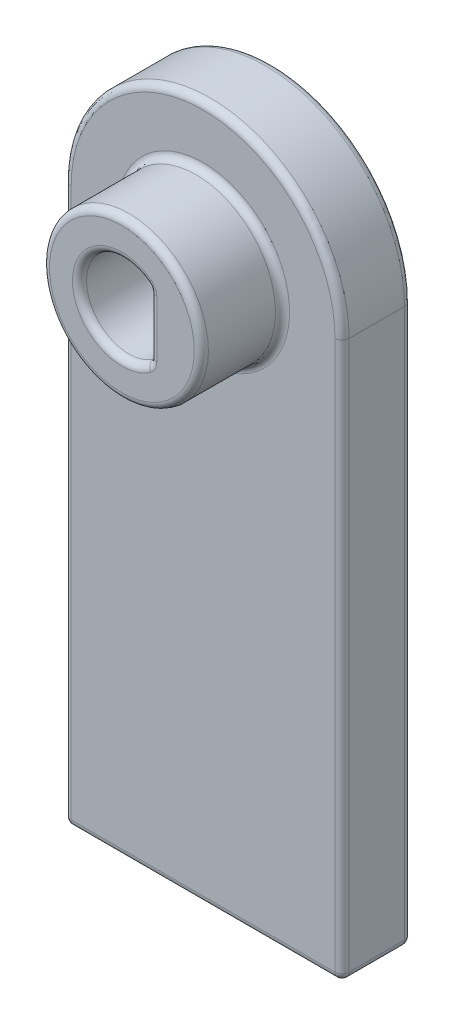
ISO-10303-21;
HEADER;
FILE_DESCRIPTION(('STEP AP214'),'2;1');
FILE_NAME('part.step','',(''),(''),'','','');
FILE_SCHEMA(('AUTOMOTIVE_DESIGN { 1 0 10303 214 1 1 1 1 }'));
ENDSEC;
DATA;
#1=APPLICATION_CONTEXT('core data for automotive mechanical design processes');
#2=APPLICATION_PROTOCOL_DEFINITION('international standard','automotive_design',2000,#1);
#3=PRODUCT_CONTEXT('',#1,'mechanical');
#4=PRODUCT('Part','Part','',(#3));
#5=PRODUCT_RELATED_PRODUCT_CATEGORY('part','',(#4));
#6=PRODUCT_DEFINITION_FORMATION('','',#4);
#7=PRODUCT_DEFINITION_CONTEXT('part definition',#1,'design');
#8=PRODUCT_DEFINITION('design','',#6,#7);
#9=PRODUCT_DEFINITION_SHAPE('','',#8);
#10=(LENGTH_UNIT() NAMED_UNIT(*) SI_UNIT(.MILLI.,.METRE.));
#11=(NAMED_UNIT(*) PLANE_ANGLE_UNIT() SI_UNIT($,.RADIAN.));
#12=(NAMED_UNIT(*) SI_UNIT($,.STERADIAN.) SOLID_ANGLE_UNIT());
#13=UNCERTAINTY_MEASURE_WITH_UNIT(LENGTH_MEASURE(1.E-05),#10,'distance_accuracy_value','');
#14=(GEOMETRIC_REPRESENTATION_CONTEXT(3) GLOBAL_UNCERTAINTY_ASSIGNED_CONTEXT((#13)) GLOBAL_UNIT_ASSIGNED_CONTEXT((#10,
#11,#12)) REPRESENTATION_CONTEXT('',''));
#15=CARTESIAN_POINT('',(0.,0.,0.));
#16=DIRECTION('',(0.,0.,1.));
#17=DIRECTION('',(1.,0.,0.));
#18=AXIS2_PLACEMENT_3D('',#15,#16,#17);
#19=CARTESIAN_POINT('',(0.,0.,5.));
#20=DIRECTION('',(0.,0.,-1.));
#21=DIRECTION('',(-1.,0.,0.));
#22=AXIS2_PLACEMENT_3D('',#19,#20,#21);
#23=PLANE('',#22);
#24=DIRECTION('',(0.,-1.,0.));
#25=VECTOR('',#24,1.);
#26=CARTESIAN_POINT('',(-9.492,0.,5.));
#27=LINE('',#26,#25);
#28=CARTESIAN_POINT('',(-9.492,0.,5.));
#29=VERTEX_POINT('',#28);
#30=CARTESIAN_POINT('',(-9.492,-39.492,5.));
#31=VERTEX_POINT('',#30);
#32=EDGE_CURVE('E270',#29,#31,#27,.T.);
#33=ORIENTED_EDGE('',*,*,#32,.T.);
#34=DIRECTION('',(1.,0.,0.));
#35=VECTOR('',#34,1.);
#36=CARTESIAN_POINT('',(0.,-39.492,5.));
#37=LINE('',#36,#35);
#38=CARTESIAN_POINT('',(9.492,-39.492,5.));
#39=VERTEX_POINT('',#38);
#40=EDGE_CURVE('E277',#31,#39,#37,.T.);
#41=ORIENTED_EDGE('',*,*,#40,.T.);
#42=DIRECTION('',(0.,1.,0.));
#43=VECTOR('',#42,1.);
#44=CARTESIAN_POINT('',(9.492,0.,5.));
#45=LINE('',#44,#43);
#46=CARTESIAN_POINT('',(9.492,0.,5.));
#47=VERTEX_POINT('',#46);
#48=EDGE_CURVE('E273',#39,#47,#45,.T.);
#49=ORIENTED_EDGE('',*,*,#48,.T.);
#50=CARTESIAN_POINT('',(0.,0.,5.));
#51=DIRECTION('',(0.,0.,-1.));
#52=DIRECTION('',(-1.,0.,0.));
#53=AXIS2_PLACEMENT_3D('',#50,#51,#52);
#54=CIRCLE('',#53,9.492);
#55=EDGE_CURVE('E267',#47,#29,#54,.F.);
#56=ORIENTED_EDGE('',*,*,#55,.T.);
#57=EDGE_LOOP('',(#33,#41,#49,#56));
#58=FACE_BOUND('',#57,.T.);
#59=CARTESIAN_POINT('',(0.,0.,5.));
#60=DIRECTION('',(0.,0.,-1.));
#61=DIRECTION('',(-1.,0.,0.));
#62=AXIS2_PLACEMENT_3D('',#59,#60,#61);
#63=CIRCLE('',#62,6.223);
#64=CARTESIAN_POINT('',(-6.223,0.,5.));
#65=VERTEX_POINT('',#64);
#66=EDGE_CURVE('E263',#65,#65,#63,.T.);
#67=ORIENTED_EDGE('',*,*,#66,.T.);
#68=EDGE_LOOP('',(#67));
#69=FACE_BOUND('',#68,.T.);
#70=ADVANCED_FACE('F39',(#58,#69),#23,.F.);
#71=CARTESIAN_POINT('',(0.,0.,5.));
#72=DIRECTION('',(0.,0.,-1.));
#73=DIRECTION('',(-1.,0.,0.));
#74=AXIS2_PLACEMENT_3D('',#71,#72,#73);
#75=CYLINDRICAL_SURFACE('',#74,10.);
#76=DIRECTION('',(0.,0.,-1.));
#77=VECTOR('',#76,1.);
#78=CARTESIAN_POINT('',(-10.,0.,5.));
#79=LINE('',#78,#77);
#80=CARTESIAN_POINT('',(-10.,0.,4.492));
#81=VERTEX_POINT('',#80);
#82=CARTESIAN_POINT('',(-10.,0.,0.508));
#83=VERTEX_POINT('',#82);
#84=EDGE_CURVE('E208',#81,#83,#79,.T.);
#85=ORIENTED_EDGE('',*,*,#84,.F.);
#86=CARTESIAN_POINT('',(0.,0.,4.492));
#87=DIRECTION('',(0.,0.,-1.));
#88=DIRECTION('',(-1.,0.,0.));
#89=AXIS2_PLACEMENT_3D('',#86,#87,#88);
#90=CIRCLE('',#89,10.);
#91=CARTESIAN_POINT('',(10.,0.,4.492));
#92=VERTEX_POINT('',#91);
#93=EDGE_CURVE('E325',#81,#92,#90,.T.);
#94=ORIENTED_EDGE('',*,*,#93,.T.);
#95=DIRECTION('',(0.,0.,-1.));
#96=VECTOR('',#95,1.);
#97=CARTESIAN_POINT('',(10.,0.,5.));
#98=LINE('',#97,#96);
#99=CARTESIAN_POINT('',(10.,0.,0.508));
#100=VERTEX_POINT('',#99);
#101=EDGE_CURVE('E212',#92,#100,#98,.T.);
#102=ORIENTED_EDGE('',*,*,#101,.T.);
#103=CARTESIAN_POINT('',(0.,0.,0.508));
#104=DIRECTION('',(0.,0.,-1.));
#105=DIRECTION('',(-1.,0.,0.));
#106=AXIS2_PLACEMENT_3D('',#103,#104,#105);
#107=CIRCLE('',#106,10.);
#108=EDGE_CURVE('E322',#100,#83,#107,.F.);
#109=ORIENTED_EDGE('',*,*,#108,.T.);
#110=EDGE_LOOP('',(#85,#94,#102,#109));
#111=FACE_BOUND('',#110,.T.);
#112=ADVANCED_FACE('F440',(#111),#75,.T.);
#113=CARTESIAN_POINT('',(-10.,0.,5.));
#114=DIRECTION('',(1.,0.,0.));
#115=DIRECTION('',(0.,1.,0.));
#116=AXIS2_PLACEMENT_3D('',#113,#114,#115);
#117=PLANE('',#116);
#118=DIRECTION('',(0.,0.,-1.));
#119=VECTOR('',#118,1.);
#120=CARTESIAN_POINT('',(-9.99999999999999,-39.492,5.));
#121=LINE('',#120,#119);
#122=CARTESIAN_POINT('',(-9.99999999999999,-39.492,0.508));
#123=VERTEX_POINT('',#122);
#124=CARTESIAN_POINT('',(-9.99999999999999,-39.492,4.492));
#125=VERTEX_POINT('',#124);
#126=EDGE_CURVE('E290',#123,#125,#121,.F.);
#127=ORIENTED_EDGE('',*,*,#126,.T.);
#128=DIRECTION('',(0.,-1.,0.));
#129=VECTOR('',#128,1.);
#130=CARTESIAN_POINT('',(-10.,0.,4.492));
#131=LINE('',#130,#129);
#132=EDGE_CURVE('E296',#125,#81,#131,.F.);
#133=ORIENTED_EDGE('',*,*,#132,.T.);
#134=ORIENTED_EDGE('',*,*,#84,.T.);
#135=DIRECTION('',(0.,-1.,0.));
#136=VECTOR('',#135,1.);
#137=CARTESIAN_POINT('',(-9.99999999999999,-40.,0.508));
#138=LINE('',#137,#136);
#139=EDGE_CURVE('E293',#83,#123,#138,.T.);
#140=ORIENTED_EDGE('',*,*,#139,.T.);
#141=EDGE_LOOP('',(#127,#133,#134,#140));
#142=FACE_BOUND('',#141,.T.);
#143=ADVANCED_FACE('F433',(#142),#117,.F.);
#144=CARTESIAN_POINT('',(-9.99999999999999,-40.,5.));
#145=DIRECTION('',(0.,1.,0.));
#146=DIRECTION('',(0.,0.,1.));
#147=AXIS2_PLACEMENT_3D('',#144,#145,#146);
#148=PLANE('',#147);
#149=DIRECTION('',(1.,0.,0.));
#150=VECTOR('',#149,1.);
#151=CARTESIAN_POINT('',(-9.99999999999999,-40.,4.492));
#152=LINE('',#151,#150);
#153=CARTESIAN_POINT('',(9.492,-40.,4.492));
#154=VERTEX_POINT('',#153);
#155=CARTESIAN_POINT('',(-9.492,-40.,4.492));
#156=VERTEX_POINT('',#155);
#157=EDGE_CURVE('E57',#154,#156,#152,.F.);
#158=ORIENTED_EDGE('',*,*,#157,.T.);
#159=DIRECTION('',(0.,0.,-1.));
#160=VECTOR('',#159,1.);
#161=CARTESIAN_POINT('',(-9.492,-40.,5.));
#162=LINE('',#161,#160);
#163=CARTESIAN_POINT('',(-9.492,-40.,0.508));
#164=VERTEX_POINT('',#163);
#165=EDGE_CURVE('E319',#156,#164,#162,.T.);
#166=ORIENTED_EDGE('',*,*,#165,.T.);
#167=DIRECTION('',(1.,0.,0.));
#168=VECTOR('',#167,1.);
#169=CARTESIAN_POINT('',(10.,-40.,0.508));
#170=LINE('',#169,#168);
#171=CARTESIAN_POINT('',(9.492,-40.,0.508));
#172=VERTEX_POINT('',#171);
#173=EDGE_CURVE('E312',#164,#172,#170,.T.);
#174=ORIENTED_EDGE('',*,*,#173,.T.);
#175=DIRECTION('',(0.,0.,-1.));
#176=VECTOR('',#175,1.);
#177=CARTESIAN_POINT('',(9.492,-40.,5.));
#178=LINE('',#177,#176);
#179=EDGE_CURVE('E62',#172,#154,#178,.F.);
#180=ORIENTED_EDGE('',*,*,#179,.T.);
#181=EDGE_LOOP('',(#158,#166,#174,#180));
#182=FACE_BOUND('',#181,.T.);
#183=ADVANCED_FACE('F485',(#182),#148,.F.);
#184=CARTESIAN_POINT('',(10.,-40.,5.));
#185=DIRECTION('',(-1.,0.,0.));
#186=DIRECTION('',(0.,-1.,0.));
#187=AXIS2_PLACEMENT_3D('',#184,#185,#186);
#188=PLANE('',#187);
#189=ORIENTED_EDGE('',*,*,#101,.F.);
#190=DIRECTION('',(0.,1.,0.));
#191=VECTOR('',#190,1.);
#192=CARTESIAN_POINT('',(10.,-40.,4.492));
#193=LINE('',#192,#191);
#194=CARTESIAN_POINT('',(10.,-39.492,4.492));
#195=VERTEX_POINT('',#194);
#196=EDGE_CURVE('E286',#92,#195,#193,.F.);
#197=ORIENTED_EDGE('',*,*,#196,.T.);
#198=DIRECTION('',(0.,0.,-1.));
#199=VECTOR('',#198,1.);
#200=CARTESIAN_POINT('',(10.,-39.492,5.));
#201=LINE('',#200,#199);
#202=CARTESIAN_POINT('',(10.,-39.492,0.508));
#203=VERTEX_POINT('',#202);
#204=EDGE_CURVE('E280',#195,#203,#201,.T.);
#205=ORIENTED_EDGE('',*,*,#204,.T.);
#206=DIRECTION('',(0.,1.,0.));
#207=VECTOR('',#206,1.);
#208=CARTESIAN_POINT('',(10.,0.,0.508));
#209=LINE('',#208,#207);
#210=EDGE_CURVE('E283',#203,#100,#209,.T.);
#211=ORIENTED_EDGE('',*,*,#210,.T.);
#212=EDGE_LOOP('',(#189,#197,#205,#211));
#213=FACE_BOUND('',#212,.T.);
#214=ADVANCED_FACE('F457',(#213),#188,.F.);
#215=CARTESIAN_POINT('',(0.,0.,0.));
#216=DIRECTION('',(0.,0.,-1.));
#217=DIRECTION('',(-1.,0.,0.));
#218=AXIS2_PLACEMENT_3D('',#215,#216,#217);
#219=PLANE('',#218);
#220=CARTESIAN_POINT('',(1.49512256240101,-2.0558143212361,0.));
#221=DIRECTION('',(0.,0.,-1.));
#222=DIRECTION('',(-1.,0.,0.));
#223=AXIS2_PLACEMENT_3D('',#220,#221,#222);
#224=CIRCLE('',#223,1.016);
#225=CARTESIAN_POINT('',(2.51112256240101,-2.0558143212361,0.));
#226=VERTEX_POINT('',#225);
#227=CARTESIAN_POINT('',(2.09270105311676,-2.87749305859875,0.));
#228=VERTEX_POINT('',#227);
#229=EDGE_CURVE('E252',#226,#228,#224,.T.);
#230=ORIENTED_EDGE('',*,*,#229,.F.);
#231=DIRECTION('',(0.,1.,0.));
#232=VECTOR('',#231,1.);
#233=CARTESIAN_POINT('',(2.51112256240101,0.,0.));
#234=LINE('',#233,#232);
#235=CARTESIAN_POINT('',(2.51112256240101,2.0558143212361,0.));
#236=VERTEX_POINT('',#235);
#237=EDGE_CURVE('E186',#226,#236,#234,.T.);
#238=ORIENTED_EDGE('',*,*,#237,.T.);
#239=CARTESIAN_POINT('',(1.49512256240101,2.0558143212361,0.));
#240=DIRECTION('',(0.,0.,-1.));
#241=DIRECTION('',(-1.,0.,0.));
#242=AXIS2_PLACEMENT_3D('',#239,#240,#241);
#243=CIRCLE('',#242,1.016);
#244=CARTESIAN_POINT('',(2.09270105311676,2.87749305859875,0.));
#245=VERTEX_POINT('',#244);
#246=EDGE_CURVE('E258',#245,#236,#243,.T.);
#247=ORIENTED_EDGE('',*,*,#246,.F.);
#248=CARTESIAN_POINT('',(0.,0.,0.));
#249=DIRECTION('',(0.,0.,-1.));
#250=DIRECTION('',(-1.,0.,0.));
#251=AXIS2_PLACEMENT_3D('',#248,#249,#250);
#252=CIRCLE('',#251,3.558);
#253=EDGE_CURVE('E255',#245,#228,#252,.F.);
#254=ORIENTED_EDGE('',*,*,#253,.T.);
#255=EDGE_LOOP('',(#230,#238,#247,#254));
#256=FACE_BOUND('',#255,.T.);
#257=DIRECTION('',(0.,1.,0.));
#258=VECTOR('',#257,1.);
#259=CARTESIAN_POINT('',(9.492,-40.,0.));
#260=LINE('',#259,#258);
#261=CARTESIAN_POINT('',(9.492,0.,0.));
#262=VERTEX_POINT('',#261);
#263=CARTESIAN_POINT('',(9.492,-39.492,0.));
#264=VERTEX_POINT('',#263);
#265=EDGE_CURVE('E245',#262,#264,#260,.F.);
#266=ORIENTED_EDGE('',*,*,#265,.T.);
#267=DIRECTION('',(1.,0.,0.));
#268=VECTOR('',#267,1.);
#269=CARTESIAN_POINT('',(-9.99999999999999,-39.492,0.));
#270=LINE('',#269,#268);
#271=CARTESIAN_POINT('',(-9.492,-39.492,0.));
#272=VERTEX_POINT('',#271);
#273=EDGE_CURVE('E249',#264,#272,#270,.F.);
#274=ORIENTED_EDGE('',*,*,#273,.T.);
#275=DIRECTION('',(0.,-1.,0.));
#276=VECTOR('',#275,1.);
#277=CARTESIAN_POINT('',(-9.492,0.,0.));
#278=LINE('',#277,#276);
#279=CARTESIAN_POINT('',(-9.492,0.,0.));
#280=VERTEX_POINT('',#279);
#281=EDGE_CURVE('E242',#272,#280,#278,.F.);
#282=ORIENTED_EDGE('',*,*,#281,.T.);
#283=CARTESIAN_POINT('',(0.,0.,0.));
#284=DIRECTION('',(0.,0.,-1.));
#285=DIRECTION('',(-1.,0.,0.));
#286=AXIS2_PLACEMENT_3D('',#283,#284,#285);
#287=CIRCLE('',#286,9.492);
#288=EDGE_CURVE('E239',#280,#262,#287,.T.);
#289=ORIENTED_EDGE('',*,*,#288,.T.);
#290=EDGE_LOOP('',(#266,#274,#282,#289));
#291=FACE_BOUND('',#290,.T.);
#292=ADVANCED_FACE('F489',(#256,#291),#219,.T.);
#293=CARTESIAN_POINT('',(0.,0.,10.842));
#294=DIRECTION('',(0.,0.,1.));
#295=DIRECTION('',(1.,0.,0.));
#296=AXIS2_PLACEMENT_3D('',#293,#294,#295);
#297=PLANE('',#296);
#298=CARTESIAN_POINT('',(1.49512256240101,2.0558143212361,10.842));
#299=DIRECTION('',(0.,0.,1.));
#300=DIRECTION('',(1.,0.,0.));
#301=AXIS2_PLACEMENT_3D('',#298,#299,#300);
#302=CIRCLE('',#301,1.016);
#303=CARTESIAN_POINT('',(2.51112256240101,2.0558143212361,10.842));
#304=VERTEX_POINT('',#303);
#305=CARTESIAN_POINT('',(2.09270105311676,2.87749305859875,10.842));
#306=VERTEX_POINT('',#305);
#307=EDGE_CURVE('E224',#304,#306,#302,.T.);
#308=ORIENTED_EDGE('',*,*,#307,.F.);
#309=DIRECTION('',(0.,1.,0.));
#310=VECTOR('',#309,1.);
#311=CARTESIAN_POINT('',(2.51112256240101,0.,10.842));
#312=LINE('',#311,#310);
#313=CARTESIAN_POINT('',(2.51112256240101,-2.0558143212361,10.842));
#314=VERTEX_POINT('',#313);
#315=EDGE_CURVE('E235',#304,#314,#312,.F.);
#316=ORIENTED_EDGE('',*,*,#315,.T.);
#317=CARTESIAN_POINT('',(1.49512256240101,-2.0558143212361,10.842));
#318=DIRECTION('',(0.,0.,1.));
#319=DIRECTION('',(1.,0.,0.));
#320=AXIS2_PLACEMENT_3D('',#317,#318,#319);
#321=CIRCLE('',#320,1.016);
#322=CARTESIAN_POINT('',(2.09270105311676,-2.87749305859875,10.842));
#323=VERTEX_POINT('',#322);
#324=EDGE_CURVE('E231',#323,#314,#321,.T.);
#325=ORIENTED_EDGE('',*,*,#324,.F.);
#326=CARTESIAN_POINT('',(0.,0.,10.842));
#327=DIRECTION('',(0.,0.,1.));
#328=DIRECTION('',(1.,0.,0.));
#329=AXIS2_PLACEMENT_3D('',#326,#327,#328);
#330=CIRCLE('',#329,3.558);
#331=EDGE_CURVE('E228',#323,#306,#330,.F.);
#332=ORIENTED_EDGE('',*,*,#331,.T.);
#333=EDGE_LOOP('',(#308,#316,#325,#332));
#334=FACE_BOUND('',#333,.T.);
#335=CARTESIAN_POINT('',(0.,0.,10.842));
#336=DIRECTION('',(0.,0.,1.));
#337=DIRECTION('',(1.,0.,0.));
#338=AXIS2_PLACEMENT_3D('',#335,#336,#337);
#339=CIRCLE('',#338,5.207);
#340=CARTESIAN_POINT('',(5.207,0.,10.842));
#341=VERTEX_POINT('',#340);
#342=EDGE_CURVE('E220',#341,#341,#339,.T.);
#343=ORIENTED_EDGE('',*,*,#342,.T.);
#344=EDGE_LOOP('',(#343));
#345=FACE_BOUND('',#344,.T.);
#346=ADVANCED_FACE('F491',(#334,#345),#297,.T.);
#347=CARTESIAN_POINT('',(0.,0.,10.842));
#348=DIRECTION('',(0.,0.,-1.));
#349=DIRECTION('',(-1.,0.,0.));
#350=AXIS2_PLACEMENT_3D('',#347,#348,#349);
#351=CYLINDRICAL_SURFACE('',#350,5.715);
#352=CARTESIAN_POINT('',(0.,0.,10.334));
#353=DIRECTION('',(0.,0.,1.));
#354=DIRECTION('',(1.,0.,0.));
#355=AXIS2_PLACEMENT_3D('',#352,#353,#354);
#356=CIRCLE('',#355,5.715);
#357=CARTESIAN_POINT('',(5.715,0.,10.334));
#358=VERTEX_POINT('',#357);
#359=EDGE_CURVE('E11',#358,#358,#356,.F.);
#360=ORIENTED_EDGE('',*,*,#359,.T.);
#361=EDGE_LOOP('',(#360));
#362=FACE_BOUND('',#361,.T.);
#363=CARTESIAN_POINT('',(0.,0.,5.508));
#364=DIRECTION('',(0.,0.,-1.));
#365=DIRECTION('',(-1.,0.,0.));
#366=AXIS2_PLACEMENT_3D('',#363,#364,#365);
#367=CIRCLE('',#366,5.715);
#368=CARTESIAN_POINT('',(-5.715,0.,5.508));
#369=VERTEX_POINT('',#368);
#370=EDGE_CURVE('E49',#369,#369,#367,.F.);
#371=ORIENTED_EDGE('',*,*,#370,.T.);
#372=EDGE_LOOP('',(#371));
#373=FACE_BOUND('',#372,.T.);
#374=ADVANCED_FACE('F498',(#362,#373),#351,.T.);
#375=CARTESIAN_POINT('',(0.,0.,10.842));
#376=DIRECTION('',(0.,0.,-1.));
#377=DIRECTION('',(-1.,0.,0.));
#378=AXIS2_PLACEMENT_3D('',#375,#376,#377);
#379=CYLINDRICAL_SURFACE('',#378,3.05);
#380=DIRECTION('',(0.,0.,-1.));
#381=VECTOR('',#380,1.);
#382=CARTESIAN_POINT('',(1.79391180775889,2.46665368991742,10.842));
#383=LINE('',#382,#381);
#384=CARTESIAN_POINT('',(1.79391180775889,2.46665368991742,0.508));
#385=VERTEX_POINT('',#384);
#386=CARTESIAN_POINT('',(1.79391180775889,2.46665368991742,10.334));
#387=VERTEX_POINT('',#386);
#388=EDGE_CURVE('E305',#385,#387,#383,.F.);
#389=ORIENTED_EDGE('',*,*,#388,.T.);
#390=CARTESIAN_POINT('',(0.,0.,10.334));
#391=DIRECTION('',(0.,0.,1.));
#392=DIRECTION('',(1.,0.,0.));
#393=AXIS2_PLACEMENT_3D('',#390,#391,#392);
#394=CIRCLE('',#393,3.05);
#395=CARTESIAN_POINT('',(1.79391180775889,-2.46665368991742,10.334));
#396=VERTEX_POINT('',#395);
#397=EDGE_CURVE('E308',#387,#396,#394,.T.);
#398=ORIENTED_EDGE('',*,*,#397,.T.);
#399=DIRECTION('',(0.,0.,-1.));
#400=VECTOR('',#399,1.);
#401=CARTESIAN_POINT('',(1.79391180775889,-2.46665368991742,10.842));
#402=LINE('',#401,#400);
#403=CARTESIAN_POINT('',(1.79391180775889,-2.46665368991742,0.508));
#404=VERTEX_POINT('',#403);
#405=EDGE_CURVE('E299',#396,#404,#402,.T.);
#406=ORIENTED_EDGE('',*,*,#405,.T.);
#407=CARTESIAN_POINT('',(0.,0.,0.508));
#408=DIRECTION('',(0.,0.,-1.));
#409=DIRECTION('',(-1.,0.,0.));
#410=AXIS2_PLACEMENT_3D('',#407,#408,#409);
#411=CIRCLE('',#410,3.05);
#412=EDGE_CURVE('E302',#404,#385,#411,.T.);
#413=ORIENTED_EDGE('',*,*,#412,.T.);
#414=EDGE_LOOP('',(#389,#398,#406,#413));
#415=FACE_BOUND('',#414,.T.);
#416=ADVANCED_FACE('F512',(#415),#379,.F.);
#417=CARTESIAN_POINT('',(2.00312256240101,2.3,10.842));
#418=DIRECTION('',(-1.,0.,0.));
#419=DIRECTION('',(0.,-1.,0.));
#420=AXIS2_PLACEMENT_3D('',#417,#418,#419);
#421=PLANE('',#420);
#422=DIRECTION('',(0.,1.,0.));
#423=VECTOR('',#422,1.);
#424=CARTESIAN_POINT('',(2.00312256240101,2.3,10.334));
#425=LINE('',#424,#423);
#426=CARTESIAN_POINT('',(2.00312256240101,-2.0558143212361,10.334));
#427=VERTEX_POINT('',#426);
#428=CARTESIAN_POINT('',(2.00312256240101,2.0558143212361,10.334));
#429=VERTEX_POINT('',#428);
#430=EDGE_CURVE('E178',#427,#429,#425,.T.);
#431=ORIENTED_EDGE('',*,*,#430,.T.);
#432=DIRECTION('',(0.,0.,1.));
#433=VECTOR('',#432,1.);
#434=CARTESIAN_POINT('',(2.00312256240101,2.0558143212361,0.));
#435=LINE('',#434,#433);
#436=CARTESIAN_POINT('',(2.00312256240101,2.0558143212361,0.508));
#437=VERTEX_POINT('',#436);
#438=EDGE_CURVE('E173',#429,#437,#435,.F.);
#439=ORIENTED_EDGE('',*,*,#438,.T.);
#440=DIRECTION('',(0.,1.,0.));
#441=VECTOR('',#440,1.);
#442=CARTESIAN_POINT('',(2.00312256240101,2.3,0.508));
#443=LINE('',#442,#441);
#444=CARTESIAN_POINT('',(2.00312256240101,-2.0558143212361,0.508));
#445=VERTEX_POINT('',#444);
#446=EDGE_CURVE('E165',#437,#445,#443,.F.);
#447=ORIENTED_EDGE('',*,*,#446,.T.);
#448=DIRECTION('',(0.,0.,1.));
#449=VECTOR('',#448,1.);
#450=CARTESIAN_POINT('',(2.00312256240101,-2.0558143212361,10.842));
#451=LINE('',#450,#449);
#452=EDGE_CURVE('E170',#445,#427,#451,.T.);
#453=ORIENTED_EDGE('',*,*,#452,.T.);
#454=EDGE_LOOP('',(#431,#439,#447,#453));
#455=FACE_BOUND('',#454,.T.);
#456=ADVANCED_FACE('F168',(#455),#421,.T.);
#457=CARTESIAN_POINT('',(2.51112256240101,0.,0.508));
#458=DIRECTION('',(0.,1.,0.));
#459=DIRECTION('',(-1.,0.,0.));
#460=AXIS2_PLACEMENT_3D('',#457,#458,#459);
#461=CYLINDRICAL_SURFACE('',#460,0.508);
#462=CARTESIAN_POINT('',(2.51112256240101,2.0558143212361,0.508));
#463=DIRECTION('',(0.,1.,0.));
#464=DIRECTION('',(0.,0.,1.));
#465=AXIS2_PLACEMENT_3D('',#462,#463,#464);
#466=CIRCLE('',#465,0.508);
#467=EDGE_CURVE('E191',#236,#437,#466,.T.);
#468=ORIENTED_EDGE('',*,*,#467,.F.);
#469=ORIENTED_EDGE('',*,*,#237,.F.);
#470=CARTESIAN_POINT('',(2.51112256240101,-2.0558143212361,0.508));
#471=DIRECTION('',(0.,-1.,0.));
#472=DIRECTION('',(0.,0.,-1.));
#473=AXIS2_PLACEMENT_3D('',#470,#471,#472);
#474=CIRCLE('',#473,0.508);
#475=EDGE_CURVE('E182',#445,#226,#474,.T.);
#476=ORIENTED_EDGE('',*,*,#475,.F.);
#477=ORIENTED_EDGE('',*,*,#446,.F.);
#478=EDGE_LOOP('',(#468,#469,#476,#477));
#479=FACE_BOUND('',#478,.T.);
#480=ADVANCED_FACE('F184',(#479),#461,.T.);
#481=CARTESIAN_POINT('',(0.,0.,0.508));
#482=DIRECTION('',(0.,0.,-1.));
#483=DIRECTION('',(-1.,0.,0.));
#484=AXIS2_PLACEMENT_3D('',#481,#482,#483);
#485=TOROIDAL_SURFACE('',#484,3.558,0.508);
#486=CARTESIAN_POINT('',(2.09270105311676,-2.87749305859875,0.508));
#487=DIRECTION('',(0.808738914727024,0.588167805822586,0.));
#488=DIRECTION('',(-0.588167805822586,0.808738914727024,0.));
#489=AXIS2_PLACEMENT_3D('',#486,#487,#488);
#490=CIRCLE('',#489,0.508);
#491=EDGE_CURVE('E190',#228,#404,#490,.T.);
#492=ORIENTED_EDGE('',*,*,#491,.F.);
#493=ORIENTED_EDGE('',*,*,#253,.F.);
#494=CARTESIAN_POINT('',(2.09270105311676,2.87749305859875,0.508));
#495=DIRECTION('',(0.808738914727025,-0.588167805822586,0.));
#496=DIRECTION('',(0.588167805822586,0.808738914727025,0.));
#497=AXIS2_PLACEMENT_3D('',#494,#495,#496);
#498=CIRCLE('',#497,0.508);
#499=EDGE_CURVE('E201',#385,#245,#498,.T.);
#500=ORIENTED_EDGE('',*,*,#499,.F.);
#501=ORIENTED_EDGE('',*,*,#412,.F.);
#502=EDGE_LOOP('',(#492,#493,#500,#501));
#503=FACE_BOUND('',#502,.T.);
#504=ADVANCED_FACE('F522',(#503),#485,.T.);
#505=CARTESIAN_POINT('',(1.49512256240101,-2.0558143212361,0.508));
#506=DIRECTION('',(0.,0.,-1.));
#507=DIRECTION('',(-1.,0.,0.));
#508=AXIS2_PLACEMENT_3D('',#505,#506,#507);
#509=TOROIDAL_SURFACE('',#508,1.016,0.508);
#510=ORIENTED_EDGE('',*,*,#229,.T.);
#511=ORIENTED_EDGE('',*,*,#491,.T.);
#512=CARTESIAN_POINT('',(1.49512256240101,-2.0558143212361,0.508));
#513=DIRECTION('',(0.,0.,-1.));
#514=DIRECTION('',(-1.,0.,0.));
#515=AXIS2_PLACEMENT_3D('',#512,#513,#514);
#516=CIRCLE('',#515,0.508);
#517=EDGE_CURVE('E195',#445,#404,#516,.T.);
#518=ORIENTED_EDGE('',*,*,#517,.F.);
#519=ORIENTED_EDGE('',*,*,#475,.T.);
#520=EDGE_LOOP('',(#510,#511,#518,#519));
#521=FACE_BOUND('',#520,.T.);
#522=ADVANCED_FACE('F196',(#521),#509,.T.);
#523=CARTESIAN_POINT('',(1.49512256240101,2.0558143212361,0.508));
#524=DIRECTION('',(0.,0.,-1.));
#525=DIRECTION('',(-1.,0.,0.));
#526=AXIS2_PLACEMENT_3D('',#523,#524,#525);
#527=TOROIDAL_SURFACE('',#526,1.016,0.508);
#528=ORIENTED_EDGE('',*,*,#246,.T.);
#529=ORIENTED_EDGE('',*,*,#467,.T.);
#530=CARTESIAN_POINT('',(1.49512256240101,2.0558143212361,0.508));
#531=DIRECTION('',(0.,0.,-1.));
#532=DIRECTION('',(-1.,0.,0.));
#533=AXIS2_PLACEMENT_3D('',#530,#531,#532);
#534=CIRCLE('',#533,0.508);
#535=EDGE_CURVE('E202',#385,#437,#534,.T.);
#536=ORIENTED_EDGE('',*,*,#535,.F.);
#537=ORIENTED_EDGE('',*,*,#499,.T.);
#538=EDGE_LOOP('',(#528,#529,#536,#537));
#539=FACE_BOUND('',#538,.T.);
#540=ADVANCED_FACE('F723',(#539),#527,.T.);
#541=CARTESIAN_POINT('',(1.49512256240101,-2.0558143212361,10.842));
#542=DIRECTION('',(0.,0.,-1.));
#543=DIRECTION('',(-1.,0.,0.));
#544=AXIS2_PLACEMENT_3D('',#541,#542,#543);
#545=CYLINDRICAL_SURFACE('',#544,0.508);
#546=ORIENTED_EDGE('',*,*,#517,.T.);
#547=ORIENTED_EDGE('',*,*,#405,.F.);
#548=CARTESIAN_POINT('',(1.49512256240101,-2.0558143212361,10.334));
#549=DIRECTION('',(0.,0.,1.));
#550=DIRECTION('',(1.,0.,0.));
#551=AXIS2_PLACEMENT_3D('',#548,#549,#550);
#552=CIRCLE('',#551,0.508);
#553=EDGE_CURVE('E205',#427,#396,#552,.F.);
#554=ORIENTED_EDGE('',*,*,#553,.F.);
#555=ORIENTED_EDGE('',*,*,#452,.F.);
#556=EDGE_LOOP('',(#546,#547,#554,#555));
#557=FACE_BOUND('',#556,.T.);
#558=ADVANCED_FACE('F204',(#557),#545,.F.);
#559=CARTESIAN_POINT('',(1.49512256240101,2.0558143212361,10.842));
#560=DIRECTION('',(0.,0.,-1.));
#561=DIRECTION('',(-1.,0.,0.));
#562=AXIS2_PLACEMENT_3D('',#559,#560,#561);
#563=CYLINDRICAL_SURFACE('',#562,0.508);
#564=ORIENTED_EDGE('',*,*,#535,.T.);
#565=ORIENTED_EDGE('',*,*,#438,.F.);
#566=CARTESIAN_POINT('',(1.49512256240101,2.0558143212361,10.334));
#567=DIRECTION('',(0.,0.,1.));
#568=DIRECTION('',(1.,0.,0.));
#569=AXIS2_PLACEMENT_3D('',#566,#567,#568);
#570=CIRCLE('',#569,0.508);
#571=EDGE_CURVE('E341',#387,#429,#570,.F.);
#572=ORIENTED_EDGE('',*,*,#571,.F.);
#573=ORIENTED_EDGE('',*,*,#388,.F.);
#574=EDGE_LOOP('',(#564,#565,#572,#573));
#575=FACE_BOUND('',#574,.T.);
#576=ADVANCED_FACE('F704',(#575),#563,.F.);
#577=CARTESIAN_POINT('',(0.,0.,10.334));
#578=DIRECTION('',(0.,0.,1.));
#579=DIRECTION('',(1.,0.,0.));
#580=AXIS2_PLACEMENT_3D('',#577,#578,#579);
#581=TOROIDAL_SURFACE('',#580,3.558,0.508);
#582=CARTESIAN_POINT('',(2.09270105311676,2.87749305859875,10.334));
#583=DIRECTION('',(0.808738914727024,-0.588167805822585,0.));
#584=DIRECTION('',(0.588167805822585,0.808738914727025,0.));
#585=AXIS2_PLACEMENT_3D('',#582,#583,#584);
#586=CIRCLE('',#585,0.508);
#587=EDGE_CURVE('E337',#306,#387,#586,.T.);
#588=ORIENTED_EDGE('',*,*,#587,.F.);
#589=ORIENTED_EDGE('',*,*,#331,.F.);
#590=CARTESIAN_POINT('',(2.09270105311676,-2.87749305859875,10.334));
#591=DIRECTION('',(0.808738914727024,0.588167805822586,0.));
#592=DIRECTION('',(-0.588167805822586,0.808738914727024,0.));
#593=AXIS2_PLACEMENT_3D('',#590,#591,#592);
#594=CIRCLE('',#593,0.508);
#595=EDGE_CURVE('E347',#396,#323,#594,.T.);
#596=ORIENTED_EDGE('',*,*,#595,.F.);
#597=ORIENTED_EDGE('',*,*,#397,.F.);
#598=EDGE_LOOP('',(#588,#589,#596,#597));
#599=FACE_BOUND('',#598,.T.);
#600=ADVANCED_FACE('F694',(#599),#581,.T.);
#601=CARTESIAN_POINT('',(1.49512256240101,-2.0558143212361,10.334));
#602=DIRECTION('',(0.,0.,1.));
#603=DIRECTION('',(1.,0.,0.));
#604=AXIS2_PLACEMENT_3D('',#601,#602,#603);
#605=TOROIDAL_SURFACE('',#604,1.016,0.508);
#606=ORIENTED_EDGE('',*,*,#595,.T.);
#607=ORIENTED_EDGE('',*,*,#324,.T.);
#608=CARTESIAN_POINT('',(2.51112256240101,-2.0558143212361,10.334));
#609=DIRECTION('',(0.,-1.,0.));
#610=DIRECTION('',(0.,0.,-1.));
#611=AXIS2_PLACEMENT_3D('',#608,#609,#610);
#612=CIRCLE('',#611,0.508);
#613=EDGE_CURVE('E334',#427,#314,#612,.F.);
#614=ORIENTED_EDGE('',*,*,#613,.F.);
#615=ORIENTED_EDGE('',*,*,#553,.T.);
#616=EDGE_LOOP('',(#606,#607,#614,#615));
#617=FACE_BOUND('',#616,.T.);
#618=ADVANCED_FACE('F684',(#617),#605,.T.);
#619=CARTESIAN_POINT('',(1.49512256240101,2.0558143212361,10.334));
#620=DIRECTION('',(0.,0.,1.));
#621=DIRECTION('',(1.,0.,0.));
#622=AXIS2_PLACEMENT_3D('',#619,#620,#621);
#623=TOROIDAL_SURFACE('',#622,1.016,0.508);
#624=ORIENTED_EDGE('',*,*,#587,.T.);
#625=ORIENTED_EDGE('',*,*,#571,.T.);
#626=CARTESIAN_POINT('',(2.51112256240101,2.0558143212361,10.334));
#627=DIRECTION('',(0.,1.,0.));
#628=DIRECTION('',(0.,0.,1.));
#629=AXIS2_PLACEMENT_3D('',#626,#627,#628);
#630=CIRCLE('',#629,0.508);
#631=EDGE_CURVE('E331',#304,#429,#630,.F.);
#632=ORIENTED_EDGE('',*,*,#631,.F.);
#633=ORIENTED_EDGE('',*,*,#307,.T.);
#634=EDGE_LOOP('',(#624,#625,#632,#633));
#635=FACE_BOUND('',#634,.T.);
#636=ADVANCED_FACE('F674',(#635),#623,.T.);
#637=CARTESIAN_POINT('',(2.51112256240101,2.3,10.334));
#638=DIRECTION('',(0.,1.,0.));
#639=DIRECTION('',(-1.,0.,0.));
#640=AXIS2_PLACEMENT_3D('',#637,#638,#639);
#641=CYLINDRICAL_SURFACE('',#640,0.508);
#642=ORIENTED_EDGE('',*,*,#613,.T.);
#643=ORIENTED_EDGE('',*,*,#315,.F.);
#644=ORIENTED_EDGE('',*,*,#631,.T.);
#645=ORIENTED_EDGE('',*,*,#430,.F.);
#646=EDGE_LOOP('',(#642,#643,#644,#645));
#647=FACE_BOUND('',#646,.T.);
#648=ADVANCED_FACE('F560',(#647),#641,.T.);
#649=CARTESIAN_POINT('',(-9.492,0.,0.508));
#650=DIRECTION('',(0.,1.,0.));
#651=DIRECTION('',(-1.,0.,0.));
#652=AXIS2_PLACEMENT_3D('',#649,#650,#651);
#653=CYLINDRICAL_SURFACE('',#652,0.508);
#654=CARTESIAN_POINT('',(-9.492,-39.492,0.508));
#655=DIRECTION('',(0.,-1.,0.));
#656=DIRECTION('',(0.,0.,-1.));
#657=AXIS2_PLACEMENT_3D('',#654,#655,#656);
#658=CIRCLE('',#657,0.508);
#659=EDGE_CURVE('E413',#123,#272,#658,.T.);
#660=ORIENTED_EDGE('',*,*,#659,.F.);
#661=ORIENTED_EDGE('',*,*,#139,.F.);
#662=CARTESIAN_POINT('',(-9.492,0.,0.508));
#663=DIRECTION('',(0.,1.,0.));
#664=DIRECTION('',(-1.,0.,0.));
#665=AXIS2_PLACEMENT_3D('',#662,#663,#664);
#666=CIRCLE('',#665,0.508);
#667=EDGE_CURVE('E43',#280,#83,#666,.T.);
#668=ORIENTED_EDGE('',*,*,#667,.F.);
#669=ORIENTED_EDGE('',*,*,#281,.F.);
#670=EDGE_LOOP('',(#660,#661,#668,#669));
#671=FACE_BOUND('',#670,.T.);
#672=ADVANCED_FACE('F431',(#671),#653,.T.);
#673=CARTESIAN_POINT('',(0.,0.,0.508));
#674=DIRECTION('',(0.,0.,-1.));
#675=DIRECTION('',(-1.,0.,0.));
#676=AXIS2_PLACEMENT_3D('',#673,#674,#675);
#677=TOROIDAL_SURFACE('',#676,9.492,0.508);
#678=ORIENTED_EDGE('',*,*,#667,.T.);
#679=ORIENTED_EDGE('',*,*,#108,.F.);
#680=CARTESIAN_POINT('',(9.492,0.,0.508));
#681=DIRECTION('',(0.,-1.,0.));
#682=DIRECTION('',(1.,0.,0.));
#683=AXIS2_PLACEMENT_3D('',#680,#681,#682);
#684=CIRCLE('',#683,0.508);
#685=EDGE_CURVE('E410',#262,#100,#684,.T.);
#686=ORIENTED_EDGE('',*,*,#685,.F.);
#687=ORIENTED_EDGE('',*,*,#288,.F.);
#688=EDGE_LOOP('',(#678,#679,#686,#687));
#689=FACE_BOUND('',#688,.T.);
#690=ADVANCED_FACE('F426',(#689),#677,.T.);
#691=CARTESIAN_POINT('',(-9.492,-39.492,0.508));
#692=DIRECTION('',(0.,0.,-1.));
#693=DIRECTION('',(-1.,0.,0.));
#694=AXIS2_PLACEMENT_3D('',#691,#692,#693);
#695=SPHERICAL_SURFACE('',#694,0.508);
#696=CARTESIAN_POINT('',(-9.492,-39.492,0.508));
#697=DIRECTION('',(0.,0.,-1.));
#698=DIRECTION('',(-1.,0.,0.));
#699=AXIS2_PLACEMENT_3D('',#696,#697,#698);
#700=CIRCLE('',#699,0.508);
#701=EDGE_CURVE('E402',#123,#164,#700,.F.);
#702=ORIENTED_EDGE('',*,*,#701,.F.);
#703=ORIENTED_EDGE('',*,*,#659,.T.);
#704=CARTESIAN_POINT('',(-9.492,-39.492,0.508));
#705=DIRECTION('',(-1.,0.,0.));
#706=DIRECTION('',(0.,0.,1.));
#707=AXIS2_PLACEMENT_3D('',#704,#705,#706);
#708=CIRCLE('',#707,0.508);
#709=EDGE_CURVE('E406',#164,#272,#708,.F.);
#710=ORIENTED_EDGE('',*,*,#709,.F.);
#711=EDGE_LOOP('',(#702,#703,#710));
#712=FACE_BOUND('',#711,.T.);
#713=ADVANCED_FACE('F554',(#712),#695,.T.);
#714=CARTESIAN_POINT('',(9.492,-40.,0.508));
#715=DIRECTION('',(0.,-1.,0.));
#716=DIRECTION('',(1.,0.,0.));
#717=AXIS2_PLACEMENT_3D('',#714,#715,#716);
#718=CYLINDRICAL_SURFACE('',#717,0.508);
#719=ORIENTED_EDGE('',*,*,#685,.T.);
#720=ORIENTED_EDGE('',*,*,#210,.F.);
#721=CARTESIAN_POINT('',(9.492,-39.492,0.508));
#722=DIRECTION('',(0.,-1.,0.));
#723=DIRECTION('',(0.,0.,-1.));
#724=AXIS2_PLACEMENT_3D('',#721,#722,#723);
#725=CIRCLE('',#724,0.508);
#726=EDGE_CURVE('E398',#264,#203,#725,.T.);
#727=ORIENTED_EDGE('',*,*,#726,.F.);
#728=ORIENTED_EDGE('',*,*,#265,.F.);
#729=EDGE_LOOP('',(#719,#720,#727,#728));
#730=FACE_BOUND('',#729,.T.);
#731=ADVANCED_FACE('F463',(#730),#718,.T.);
#732=CARTESIAN_POINT('',(-9.99999999999999,-39.492,0.508));
#733=DIRECTION('',(-1.,0.,0.));
#734=DIRECTION('',(0.,0.,1.));
#735=AXIS2_PLACEMENT_3D('',#732,#733,#734);
#736=CYLINDRICAL_SURFACE('',#735,0.508);
#737=ORIENTED_EDGE('',*,*,#709,.T.);
#738=ORIENTED_EDGE('',*,*,#273,.F.);
#739=CARTESIAN_POINT('',(9.492,-39.492,0.508));
#740=DIRECTION('',(1.,0.,0.));
#741=DIRECTION('',(0.,0.,-1.));
#742=AXIS2_PLACEMENT_3D('',#739,#740,#741);
#743=CIRCLE('',#742,0.508);
#744=EDGE_CURVE('E395',#172,#264,#743,.T.);
#745=ORIENTED_EDGE('',*,*,#744,.F.);
#746=ORIENTED_EDGE('',*,*,#173,.F.);
#747=EDGE_LOOP('',(#737,#738,#745,#746));
#748=FACE_BOUND('',#747,.T.);
#749=ADVANCED_FACE('F487',(#748),#736,.T.);
#750=CARTESIAN_POINT('',(-9.492,-39.492,5.));
#751=DIRECTION('',(0.,0.,-1.));
#752=DIRECTION('',(-1.,0.,0.));
#753=AXIS2_PLACEMENT_3D('',#750,#751,#752);
#754=CYLINDRICAL_SURFACE('',#753,0.508);
#755=ORIENTED_EDGE('',*,*,#701,.T.);
#756=ORIENTED_EDGE('',*,*,#165,.F.);
#757=CARTESIAN_POINT('',(-9.492,-39.492,4.492));
#758=DIRECTION('',(0.,0.,1.));
#759=DIRECTION('',(1.,0.,0.));
#760=AXIS2_PLACEMENT_3D('',#757,#758,#759);
#761=CIRCLE('',#760,0.508);
#762=EDGE_CURVE('E391',#125,#156,#761,.T.);
#763=ORIENTED_EDGE('',*,*,#762,.F.);
#764=ORIENTED_EDGE('',*,*,#126,.F.);
#765=EDGE_LOOP('',(#755,#756,#763,#764));
#766=FACE_BOUND('',#765,.T.);
#767=ADVANCED_FACE('F484',(#766),#754,.T.);
#768=CARTESIAN_POINT('',(9.492,-39.492,0.508));
#769=DIRECTION('',(0.,0.,-1.));
#770=DIRECTION('',(-1.,0.,0.));
#771=AXIS2_PLACEMENT_3D('',#768,#769,#770);
#772=SPHERICAL_SURFACE('',#771,0.508);
#773=ORIENTED_EDGE('',*,*,#744,.T.);
#774=ORIENTED_EDGE('',*,*,#726,.T.);
#775=CARTESIAN_POINT('',(9.492,-39.492,0.508));
#776=DIRECTION('',(0.,0.,-1.));
#777=DIRECTION('',(-1.,0.,0.));
#778=AXIS2_PLACEMENT_3D('',#775,#776,#777);
#779=CIRCLE('',#778,0.508);
#780=EDGE_CURVE('E387',#172,#203,#779,.F.);
#781=ORIENTED_EDGE('',*,*,#780,.F.);
#782=EDGE_LOOP('',(#773,#774,#781));
#783=FACE_BOUND('',#782,.T.);
#784=ADVANCED_FACE('F468',(#783),#772,.T.);
#785=CARTESIAN_POINT('',(-9.492,-39.492,4.492));
#786=DIRECTION('',(0.,-1.,0.));
#787=DIRECTION('',(0.,0.,-1.));
#788=AXIS2_PLACEMENT_3D('',#785,#786,#787);
#789=SPHERICAL_SURFACE('',#788,0.508);
#790=CARTESIAN_POINT('',(-9.492,-39.492,4.492));
#791=DIRECTION('',(0.,-1.,0.));
#792=DIRECTION('',(0.,0.,-1.));
#793=AXIS2_PLACEMENT_3D('',#790,#791,#792);
#794=CIRCLE('',#793,0.508);
#795=EDGE_CURVE('E379',#125,#31,#794,.F.);
#796=ORIENTED_EDGE('',*,*,#795,.F.);
#797=ORIENTED_EDGE('',*,*,#762,.T.);
#798=CARTESIAN_POINT('',(-9.492,-39.492,4.492));
#799=DIRECTION('',(-1.,0.,0.));
#800=DIRECTION('',(0.,0.,1.));
#801=AXIS2_PLACEMENT_3D('',#798,#799,#800);
#802=CIRCLE('',#801,0.508);
#803=EDGE_CURVE('E383',#31,#156,#802,.F.);
#804=ORIENTED_EDGE('',*,*,#803,.F.);
#805=EDGE_LOOP('',(#796,#797,#804));
#806=FACE_BOUND('',#805,.T.);
#807=ADVANCED_FACE('F482',(#806),#789,.T.);
#808=CARTESIAN_POINT('',(9.492,-39.492,5.));
#809=DIRECTION('',(0.,0.,-1.));
#810=DIRECTION('',(-1.,0.,0.));
#811=AXIS2_PLACEMENT_3D('',#808,#809,#810);
#812=CYLINDRICAL_SURFACE('',#811,0.508);
#813=ORIENTED_EDGE('',*,*,#780,.T.);
#814=ORIENTED_EDGE('',*,*,#204,.F.);
#815=CARTESIAN_POINT('',(9.492,-39.492,4.492));
#816=DIRECTION('',(0.,0.,1.));
#817=DIRECTION('',(1.,0.,0.));
#818=AXIS2_PLACEMENT_3D('',#815,#816,#817);
#819=CIRCLE('',#818,0.508);
#820=EDGE_CURVE('E375',#154,#195,#819,.T.);
#821=ORIENTED_EDGE('',*,*,#820,.F.);
#822=ORIENTED_EDGE('',*,*,#179,.F.);
#823=EDGE_LOOP('',(#813,#814,#821,#822));
#824=FACE_BOUND('',#823,.T.);
#825=ADVANCED_FACE('F471',(#824),#812,.T.);
#826=CARTESIAN_POINT('',(0.,-39.492,4.492));
#827=DIRECTION('',(1.,0.,0.));
#828=DIRECTION('',(0.,0.,-1.));
#829=AXIS2_PLACEMENT_3D('',#826,#827,#828);
#830=CYLINDRICAL_SURFACE('',#829,0.508);
#831=ORIENTED_EDGE('',*,*,#803,.T.);
#832=ORIENTED_EDGE('',*,*,#157,.F.);
#833=CARTESIAN_POINT('',(9.492,-39.492,4.492));
#834=DIRECTION('',(1.,0.,0.));
#835=DIRECTION('',(0.,0.,-1.));
#836=AXIS2_PLACEMENT_3D('',#833,#834,#835);
#837=CIRCLE('',#836,0.508);
#838=EDGE_CURVE('E371',#39,#154,#837,.T.);
#839=ORIENTED_EDGE('',*,*,#838,.F.);
#840=ORIENTED_EDGE('',*,*,#40,.F.);
#841=EDGE_LOOP('',(#831,#832,#839,#840));
#842=FACE_BOUND('',#841,.T.);
#843=ADVANCED_FACE('F478',(#842),#830,.T.);
#844=CARTESIAN_POINT('',(-9.492,0.,4.492));
#845=DIRECTION('',(0.,-1.,0.));
#846=DIRECTION('',(1.,0.,0.));
#847=AXIS2_PLACEMENT_3D('',#844,#845,#846);
#848=CYLINDRICAL_SURFACE('',#847,0.508);
#849=ORIENTED_EDGE('',*,*,#795,.T.);
#850=ORIENTED_EDGE('',*,*,#32,.F.);
#851=CARTESIAN_POINT('',(-9.492,0.,4.492));
#852=DIRECTION('',(0.,1.,0.));
#853=DIRECTION('',(-1.,0.,0.));
#854=AXIS2_PLACEMENT_3D('',#851,#852,#853);
#855=CIRCLE('',#854,0.508);
#856=EDGE_CURVE('E367',#81,#29,#855,.T.);
#857=ORIENTED_EDGE('',*,*,#856,.F.);
#858=ORIENTED_EDGE('',*,*,#132,.F.);
#859=EDGE_LOOP('',(#849,#850,#857,#858));
#860=FACE_BOUND('',#859,.T.);
#861=ADVANCED_FACE('F446',(#860),#848,.T.);
#862=CARTESIAN_POINT('',(9.492,-39.492,4.492));
#863=DIRECTION('',(0.,-1.,0.));
#864=DIRECTION('',(0.,0.,-1.));
#865=AXIS2_PLACEMENT_3D('',#862,#863,#864);
#866=SPHERICAL_SURFACE('',#865,0.508);
#867=ORIENTED_EDGE('',*,*,#838,.T.);
#868=ORIENTED_EDGE('',*,*,#820,.T.);
#869=CARTESIAN_POINT('',(9.492,-39.492,4.492));
#870=DIRECTION('',(0.,-1.,0.));
#871=DIRECTION('',(0.,0.,-1.));
#872=AXIS2_PLACEMENT_3D('',#869,#870,#871);
#873=CIRCLE('',#872,0.508);
#874=EDGE_CURVE('E364',#39,#195,#873,.F.);
#875=ORIENTED_EDGE('',*,*,#874,.F.);
#876=EDGE_LOOP('',(#867,#868,#875));
#877=FACE_BOUND('',#876,.T.);
#878=ADVANCED_FACE('F475',(#877),#866,.T.);
#879=CARTESIAN_POINT('',(0.,0.,4.492));
#880=DIRECTION('',(0.,0.,-1.));
#881=DIRECTION('',(-1.,0.,0.));
#882=AXIS2_PLACEMENT_3D('',#879,#880,#881);
#883=TOROIDAL_SURFACE('',#882,9.492,0.508);
#884=ORIENTED_EDGE('',*,*,#856,.T.);
#885=ORIENTED_EDGE('',*,*,#55,.F.);
#886=CARTESIAN_POINT('',(9.492,0.,4.492));
#887=DIRECTION('',(0.,-1.,0.));
#888=DIRECTION('',(0.,0.,-1.));
#889=AXIS2_PLACEMENT_3D('',#886,#887,#888);
#890=CIRCLE('',#889,0.508);
#891=EDGE_CURVE('E361',#92,#47,#890,.T.);
#892=ORIENTED_EDGE('',*,*,#891,.F.);
#893=ORIENTED_EDGE('',*,*,#93,.F.);
#894=EDGE_LOOP('',(#884,#885,#892,#893));
#895=FACE_BOUND('',#894,.T.);
#896=ADVANCED_FACE('F450',(#895),#883,.T.);
#897=CARTESIAN_POINT('',(9.492,0.,4.492));
#898=DIRECTION('',(0.,1.,0.));
#899=DIRECTION('',(-1.,0.,0.));
#900=AXIS2_PLACEMENT_3D('',#897,#898,#899);
#901=CYLINDRICAL_SURFACE('',#900,0.508);
#902=ORIENTED_EDGE('',*,*,#874,.T.);
#903=ORIENTED_EDGE('',*,*,#196,.F.);
#904=ORIENTED_EDGE('',*,*,#891,.T.);
#905=ORIENTED_EDGE('',*,*,#48,.F.);
#906=EDGE_LOOP('',(#902,#903,#904,#905));
#907=FACE_BOUND('',#906,.T.);
#908=ADVANCED_FACE('F454',(#907),#901,.T.);
#909=CARTESIAN_POINT('',(0.,0.,10.334));
#910=DIRECTION('',(0.,0.,1.));
#911=DIRECTION('',(1.,0.,0.));
#912=AXIS2_PLACEMENT_3D('',#909,#910,#911);
#913=TOROIDAL_SURFACE('',#912,5.207,0.508);
#914=ORIENTED_EDGE('',*,*,#359,.F.);
#915=EDGE_LOOP('',(#914));
#916=FACE_BOUND('',#915,.T.);
#917=ORIENTED_EDGE('',*,*,#342,.F.);
#918=EDGE_LOOP('',(#917));
#919=FACE_BOUND('',#918,.T.);
#920=ADVANCED_FACE('F533',(#916,#919),#913,.T.);
#921=CARTESIAN_POINT('',(0.,0.,5.508));
#922=DIRECTION('',(0.,0.,-1.));
#923=DIRECTION('',(-1.,0.,0.));
#924=AXIS2_PLACEMENT_3D('',#921,#922,#923);
#925=TOROIDAL_SURFACE('',#924,6.223,0.508);
#926=ORIENTED_EDGE('',*,*,#66,.F.);
#927=EDGE_LOOP('',(#926));
#928=FACE_BOUND('',#927,.T.);
#929=ORIENTED_EDGE('',*,*,#370,.F.);
#930=EDGE_LOOP('',(#929));
#931=FACE_BOUND('',#930,.T.);
#932=ADVANCED_FACE('F41',(#928,#931),#925,.F.);
#933=CLOSED_SHELL('',(#70,#112,#143,#183,#214,#292,#346,#374,#416,#456,#480,#504,#522,#540,#558,
#576,#600,#618,#636,#648,#672,#690,#713,#731,#749,#767,#784,#807,#825,#843,#861,#878,#896,#908,
#920,#932));
#934=MANIFOLD_SOLID_BREP('B2',#933);
#935=ADVANCED_BREP_SHAPE_REPRESENTATION('',(#18,#934),#14);
#936=SHAPE_DEFINITION_REPRESENTATION(#9,#935);
ENDSEC;
END-ISO-10303-21;
